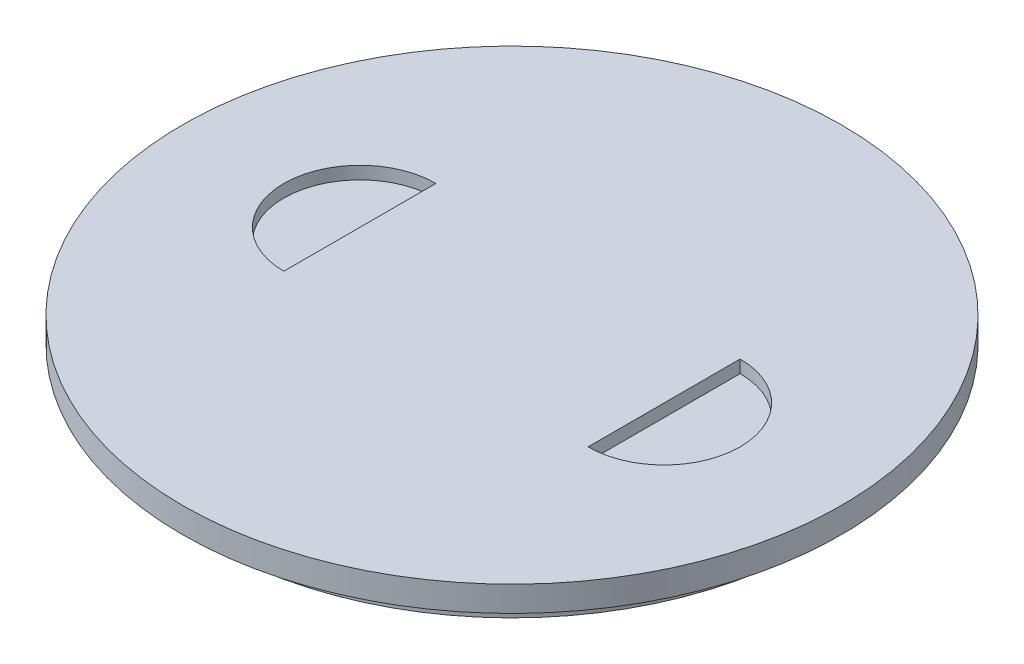
ISO-10303-21;
HEADER;
FILE_DESCRIPTION(('STEP AP214'),'2;1');
FILE_NAME('part.step','',(''),(''),'','','');
FILE_SCHEMA(('AUTOMOTIVE_DESIGN { 1 0 10303 214 1 1 1 1 }'));
ENDSEC;
DATA;
#1=APPLICATION_CONTEXT('core data for automotive mechanical design processes');
#2=APPLICATION_PROTOCOL_DEFINITION('international standard','automotive_design',2000,#1);
#3=PRODUCT_CONTEXT('',#1,'mechanical');
#4=PRODUCT('Part','Part','',(#3));
#5=PRODUCT_RELATED_PRODUCT_CATEGORY('part','',(#4));
#6=PRODUCT_DEFINITION_FORMATION('','',#4);
#7=PRODUCT_DEFINITION_CONTEXT('part definition',#1,'design');
#8=PRODUCT_DEFINITION('design','',#6,#7);
#9=PRODUCT_DEFINITION_SHAPE('','',#8);
#10=(LENGTH_UNIT() NAMED_UNIT(*) SI_UNIT(.MILLI.,.METRE.));
#11=(NAMED_UNIT(*) PLANE_ANGLE_UNIT() SI_UNIT($,.RADIAN.));
#12=(NAMED_UNIT(*) SI_UNIT($,.STERADIAN.) SOLID_ANGLE_UNIT());
#13=UNCERTAINTY_MEASURE_WITH_UNIT(LENGTH_MEASURE(1.E-05),#10,'distance_accuracy_value','');
#14=(GEOMETRIC_REPRESENTATION_CONTEXT(3) GLOBAL_UNCERTAINTY_ASSIGNED_CONTEXT((#13)) GLOBAL_UNIT_ASSIGNED_CONTEXT((#10,
#11,#12)) REPRESENTATION_CONTEXT('',''));
#15=CARTESIAN_POINT('',(0.,0.,0.));
#16=DIRECTION('',(0.,0.,1.));
#17=DIRECTION('',(1.,0.,0.));
#18=AXIS2_PLACEMENT_3D('',#15,#16,#17);
#19=CARTESIAN_POINT('',(0.,6.35,0.));
#20=DIRECTION('',(0.,-1.,0.));
#21=DIRECTION('',(0.,0.,-1.));
#22=AXIS2_PLACEMENT_3D('',#19,#20,#21);
#23=CYLINDRICAL_SURFACE('',#22,82.55);
#24=CARTESIAN_POINT('',(0.,6.35,0.));
#25=DIRECTION('',(0.,1.,0.));
#26=DIRECTION('',(0.,0.,1.));
#27=AXIS2_PLACEMENT_3D('',#24,#25,#26);
#28=CIRCLE('',#27,82.55);
#29=CARTESIAN_POINT('',(0.,6.35,82.55));
#30=VERTEX_POINT('',#29);
#31=EDGE_CURVE('E55',#30,#30,#28,.T.);
#32=ORIENTED_EDGE('',*,*,#31,.F.);
#33=EDGE_LOOP('',(#32));
#34=FACE_BOUND('',#33,.T.);
#35=CARTESIAN_POINT('',(0.,0.,0.));
#36=DIRECTION('',(0.,1.,0.));
#37=DIRECTION('',(0.,0.,1.));
#38=AXIS2_PLACEMENT_3D('',#35,#36,#37);
#39=CIRCLE('',#38,82.55);
#40=CARTESIAN_POINT('',(0.,0.,82.55));
#41=VERTEX_POINT('',#40);
#42=EDGE_CURVE('E143',#41,#41,#39,.T.);
#43=ORIENTED_EDGE('',*,*,#42,.T.);
#44=EDGE_LOOP('',(#43));
#45=FACE_BOUND('',#44,.T.);
#46=ADVANCED_FACE('F47',(#34,#45),#23,.T.);
#47=CARTESIAN_POINT('',(0.,6.35,0.));
#48=DIRECTION('',(0.,1.,0.));
#49=DIRECTION('',(0.,0.,1.));
#50=AXIS2_PLACEMENT_3D('',#47,#48,#49);
#51=PLANE('',#50);
#52=CARTESIAN_POINT('',(-38.1,6.35,0.));
#53=DIRECTION('',(0.,1.,0.));
#54=DIRECTION('',(0.,0.,1.));
#55=AXIS2_PLACEMENT_3D('',#52,#53,#54);
#56=CIRCLE('',#55,19.05);
#57=CARTESIAN_POINT('',(-38.1,6.35,-19.05));
#58=VERTEX_POINT('',#57);
#59=CARTESIAN_POINT('',(-38.1,6.35,19.05));
#60=VERTEX_POINT('',#59);
#61=EDGE_CURVE('E62',#58,#60,#56,.T.);
#62=ORIENTED_EDGE('',*,*,#61,.F.);
#63=DIRECTION('',(0.,0.,-1.));
#64=VECTOR('',#63,1.);
#65=CARTESIAN_POINT('',(-38.1,6.35,-19.05));
#66=LINE('',#65,#64);
#67=EDGE_CURVE('E102',#60,#58,#66,.T.);
#68=ORIENTED_EDGE('',*,*,#67,.F.);
#69=EDGE_LOOP('',(#62,#68));
#70=FACE_BOUND('',#69,.T.);
#71=CARTESIAN_POINT('',(38.1,6.35,0.));
#72=DIRECTION('',(0.,1.,0.));
#73=DIRECTION('',(0.,0.,-1.));
#74=AXIS2_PLACEMENT_3D('',#71,#72,#73);
#75=CIRCLE('',#74,19.05);
#76=CARTESIAN_POINT('',(38.1,6.35,19.05));
#77=VERTEX_POINT('',#76);
#78=CARTESIAN_POINT('',(38.1,6.35,-19.05));
#79=VERTEX_POINT('',#78);
#80=EDGE_CURVE('E70',#77,#79,#75,.T.);
#81=ORIENTED_EDGE('',*,*,#80,.F.);
#82=DIRECTION('',(0.,0.,1.));
#83=VECTOR('',#82,1.);
#84=CARTESIAN_POINT('',(38.1,6.35,-19.05));
#85=LINE('',#84,#83);
#86=EDGE_CURVE('E122',#79,#77,#85,.T.);
#87=ORIENTED_EDGE('',*,*,#86,.F.);
#88=EDGE_LOOP('',(#81,#87));
#89=FACE_BOUND('',#88,.T.);
#90=ORIENTED_EDGE('',*,*,#31,.T.);
#91=EDGE_LOOP('',(#90));
#92=FACE_BOUND('',#91,.T.);
#93=ADVANCED_FACE('F157',(#70,#89,#92),#51,.T.);
#94=CARTESIAN_POINT('',(0.,0.,0.));
#95=DIRECTION('',(0.,1.,0.));
#96=DIRECTION('',(0.,0.,1.));
#97=AXIS2_PLACEMENT_3D('',#94,#95,#96);
#98=PLANE('',#97);
#99=CARTESIAN_POINT('',(0.,0.,0.));
#100=DIRECTION('',(0.,1.,0.));
#101=DIRECTION('',(0.,0.,1.));
#102=AXIS2_PLACEMENT_3D('',#99,#100,#101);
#103=CIRCLE('',#102,74.93);
#104=CARTESIAN_POINT('',(0.,0.,74.93));
#105=VERTEX_POINT('',#104);
#106=EDGE_CURVE('E113',#105,#105,#103,.T.);
#107=ORIENTED_EDGE('',*,*,#106,.T.);
#108=EDGE_LOOP('',(#107));
#109=FACE_BOUND('',#108,.T.);
#110=ORIENTED_EDGE('',*,*,#42,.F.);
#111=EDGE_LOOP('',(#110));
#112=FACE_BOUND('',#111,.T.);
#113=ADVANCED_FACE('F154',(#109,#112),#98,.F.);
#114=CARTESIAN_POINT('',(0.,-6.35,0.));
#115=DIRECTION('',(0.,1.,0.));
#116=DIRECTION('',(0.,0.,1.));
#117=AXIS2_PLACEMENT_3D('',#114,#115,#116);
#118=CYLINDRICAL_SURFACE('',#117,69.85);
#119=CARTESIAN_POINT('',(0.,-6.35,0.));
#120=DIRECTION('',(0.,1.,0.));
#121=DIRECTION('',(0.,0.,1.));
#122=AXIS2_PLACEMENT_3D('',#119,#120,#121);
#123=CIRCLE('',#122,69.85);
#124=CARTESIAN_POINT('',(0.,-6.35,69.85));
#125=VERTEX_POINT('',#124);
#126=EDGE_CURVE('E135',#125,#125,#123,.T.);
#127=ORIENTED_EDGE('',*,*,#126,.F.);
#128=EDGE_LOOP('',(#127));
#129=FACE_BOUND('',#128,.T.);
#130=CARTESIAN_POINT('',(0.,0.,0.));
#131=DIRECTION('',(0.,1.,0.));
#132=DIRECTION('',(0.,0.,1.));
#133=AXIS2_PLACEMENT_3D('',#130,#131,#132);
#134=CIRCLE('',#133,69.85);
#135=CARTESIAN_POINT('',(0.,0.,69.85));
#136=VERTEX_POINT('',#135);
#137=EDGE_CURVE('E11',#136,#136,#134,.T.);
#138=ORIENTED_EDGE('',*,*,#137,.T.);
#139=EDGE_LOOP('',(#138));
#140=FACE_BOUND('',#139,.T.);
#141=ADVANCED_FACE('F156',(#129,#140),#118,.F.);
#142=CARTESIAN_POINT('',(0.,-6.35,0.));
#143=DIRECTION('',(0.,1.,0.));
#144=DIRECTION('',(0.,0.,1.));
#145=AXIS2_PLACEMENT_3D('',#142,#143,#144);
#146=CYLINDRICAL_SURFACE('',#145,74.93);
#147=CARTESIAN_POINT('',(0.,-6.35,0.));
#148=DIRECTION('',(0.,1.,0.));
#149=DIRECTION('',(0.,0.,1.));
#150=AXIS2_PLACEMENT_3D('',#147,#148,#149);
#151=CIRCLE('',#150,74.93);
#152=CARTESIAN_POINT('',(0.,-6.35,74.93));
#153=VERTEX_POINT('',#152);
#154=EDGE_CURVE('E139',#153,#153,#151,.T.);
#155=ORIENTED_EDGE('',*,*,#154,.T.);
#156=EDGE_LOOP('',(#155));
#157=FACE_BOUND('',#156,.T.);
#158=ORIENTED_EDGE('',*,*,#106,.F.);
#159=EDGE_LOOP('',(#158));
#160=FACE_BOUND('',#159,.T.);
#161=ADVANCED_FACE('F164',(#157,#160),#146,.T.);
#162=CARTESIAN_POINT('',(0.,-6.35,0.));
#163=DIRECTION('',(0.,1.,0.));
#164=DIRECTION('',(0.,0.,1.));
#165=AXIS2_PLACEMENT_3D('',#162,#163,#164);
#166=PLANE('',#165);
#167=ORIENTED_EDGE('',*,*,#126,.T.);
#168=EDGE_LOOP('',(#167));
#169=FACE_BOUND('',#168,.T.);
#170=ORIENTED_EDGE('',*,*,#154,.F.);
#171=EDGE_LOOP('',(#170));
#172=FACE_BOUND('',#171,.T.);
#173=ADVANCED_FACE('F172',(#169,#172),#166,.F.);
#174=ORIENTED_EDGE('',*,*,#137,.F.);
#175=EDGE_LOOP('',(#174));
#176=FACE_BOUND('',#175,.T.);
#177=ADVANCED_FACE('F159',(#176),#98,.F.);
#178=CARTESIAN_POINT('',(38.1,3.175,0.));
#179=DIRECTION('',(0.,1.,0.));
#180=DIRECTION('',(0.,0.,1.));
#181=AXIS2_PLACEMENT_3D('',#178,#179,#180);
#182=CYLINDRICAL_SURFACE('',#181,19.05);
#183=ORIENTED_EDGE('',*,*,#80,.T.);
#184=DIRECTION('',(0.,1.,0.));
#185=VECTOR('',#184,1.);
#186=CARTESIAN_POINT('',(38.1,3.175,-19.05));
#187=LINE('',#186,#185);
#188=CARTESIAN_POINT('',(38.1,3.175,-19.05));
#189=VERTEX_POINT('',#188);
#190=EDGE_CURVE('E115',#189,#79,#187,.T.);
#191=ORIENTED_EDGE('',*,*,#190,.F.);
#192=CARTESIAN_POINT('',(38.1,3.175,0.));
#193=DIRECTION('',(0.,1.,0.));
#194=DIRECTION('',(0.,0.,-1.));
#195=AXIS2_PLACEMENT_3D('',#192,#193,#194);
#196=CIRCLE('',#195,19.05);
#197=CARTESIAN_POINT('',(38.1,3.175,19.05));
#198=VERTEX_POINT('',#197);
#199=EDGE_CURVE('E126',#198,#189,#196,.T.);
#200=ORIENTED_EDGE('',*,*,#199,.F.);
#201=DIRECTION('',(0.,1.,0.));
#202=VECTOR('',#201,1.);
#203=CARTESIAN_POINT('',(38.1,3.175,19.05));
#204=LINE('',#203,#202);
#205=EDGE_CURVE('E119',#198,#77,#204,.T.);
#206=ORIENTED_EDGE('',*,*,#205,.T.);
#207=EDGE_LOOP('',(#183,#191,#200,#206));
#208=FACE_BOUND('',#207,.T.);
#209=ADVANCED_FACE('F171',(#208),#182,.F.);
#210=CARTESIAN_POINT('',(38.1,3.175,-19.05));
#211=DIRECTION('',(-1.,0.,0.));
#212=DIRECTION('',(0.,0.,1.));
#213=AXIS2_PLACEMENT_3D('',#210,#211,#212);
#214=PLANE('',#213);
#215=ORIENTED_EDGE('',*,*,#86,.T.);
#216=ORIENTED_EDGE('',*,*,#205,.F.);
#217=DIRECTION('',(0.,0.,1.));
#218=VECTOR('',#217,1.);
#219=CARTESIAN_POINT('',(38.1,3.175,-19.05));
#220=LINE('',#219,#218);
#221=EDGE_CURVE('E118',#189,#198,#220,.T.);
#222=ORIENTED_EDGE('',*,*,#221,.F.);
#223=ORIENTED_EDGE('',*,*,#190,.T.);
#224=EDGE_LOOP('',(#215,#216,#222,#223));
#225=FACE_BOUND('',#224,.T.);
#226=ADVANCED_FACE('F229',(#225),#214,.F.);
#227=CARTESIAN_POINT('',(38.1,3.175,0.));
#228=DIRECTION('',(0.,-1.,0.));
#229=DIRECTION('',(0.,0.,-1.));
#230=AXIS2_PLACEMENT_3D('',#227,#228,#229);
#231=PLANE('',#230);
#232=ORIENTED_EDGE('',*,*,#199,.T.);
#233=ORIENTED_EDGE('',*,*,#221,.T.);
#234=EDGE_LOOP('',(#232,#233));
#235=FACE_BOUND('',#234,.T.);
#236=ADVANCED_FACE('F238',(#235),#231,.F.);
#237=CARTESIAN_POINT('',(-38.1,3.175,0.));
#238=DIRECTION('',(0.,1.,0.));
#239=DIRECTION('',(0.,0.,1.));
#240=AXIS2_PLACEMENT_3D('',#237,#238,#239);
#241=CYLINDRICAL_SURFACE('',#240,19.05);
#242=ORIENTED_EDGE('',*,*,#61,.T.);
#243=DIRECTION('',(0.,1.,0.));
#244=VECTOR('',#243,1.);
#245=CARTESIAN_POINT('',(-38.1,3.175,19.05));
#246=LINE('',#245,#244);
#247=CARTESIAN_POINT('',(-38.1,3.175,19.05));
#248=VERTEX_POINT('',#247);
#249=EDGE_CURVE('E86',#248,#60,#246,.T.);
#250=ORIENTED_EDGE('',*,*,#249,.F.);
#251=CARTESIAN_POINT('',(-38.1,3.175,0.));
#252=DIRECTION('',(0.,1.,0.));
#253=DIRECTION('',(0.,0.,1.));
#254=AXIS2_PLACEMENT_3D('',#251,#252,#253);
#255=CIRCLE('',#254,19.05);
#256=CARTESIAN_POINT('',(-38.1,3.175,-19.05));
#257=VERTEX_POINT('',#256);
#258=EDGE_CURVE('E89',#257,#248,#255,.T.);
#259=ORIENTED_EDGE('',*,*,#258,.F.);
#260=DIRECTION('',(0.,1.,0.));
#261=VECTOR('',#260,1.);
#262=CARTESIAN_POINT('',(-38.1,3.175,-19.05));
#263=LINE('',#262,#261);
#264=EDGE_CURVE('E96',#257,#58,#263,.T.);
#265=ORIENTED_EDGE('',*,*,#264,.T.);
#266=EDGE_LOOP('',(#242,#250,#259,#265));
#267=FACE_BOUND('',#266,.T.);
#268=ADVANCED_FACE('F88',(#267),#241,.F.);
#269=CARTESIAN_POINT('',(-38.1,3.175,-19.05));
#270=DIRECTION('',(1.,0.,0.));
#271=DIRECTION('',(0.,0.,-1.));
#272=AXIS2_PLACEMENT_3D('',#269,#270,#271);
#273=PLANE('',#272);
#274=ORIENTED_EDGE('',*,*,#67,.T.);
#275=ORIENTED_EDGE('',*,*,#264,.F.);
#276=DIRECTION('',(0.,0.,-1.));
#277=VECTOR('',#276,1.);
#278=CARTESIAN_POINT('',(-38.1,3.175,-19.05));
#279=LINE('',#278,#277);
#280=EDGE_CURVE('E97',#248,#257,#279,.T.);
#281=ORIENTED_EDGE('',*,*,#280,.F.);
#282=ORIENTED_EDGE('',*,*,#249,.T.);
#283=EDGE_LOOP('',(#274,#275,#281,#282));
#284=FACE_BOUND('',#283,.T.);
#285=ADVANCED_FACE('F104',(#284),#273,.F.);
#286=CARTESIAN_POINT('',(-38.1,3.175,0.));
#287=DIRECTION('',(0.,1.,0.));
#288=DIRECTION('',(0.,0.,1.));
#289=AXIS2_PLACEMENT_3D('',#286,#287,#288);
#290=PLANE('',#289);
#291=ORIENTED_EDGE('',*,*,#258,.T.);
#292=ORIENTED_EDGE('',*,*,#280,.T.);
#293=EDGE_LOOP('',(#291,#292));
#294=FACE_BOUND('',#293,.T.);
#295=ADVANCED_FACE('F100',(#294),#290,.T.);
#296=CLOSED_SHELL('',(#46,#93,#113,#141,#161,#173,#177,#209,#226,#236,#268,#285,#295));
#297=MANIFOLD_SOLID_BREP('B2',#296);
#298=ADVANCED_BREP_SHAPE_REPRESENTATION('',(#18,#297),#14);
#299=SHAPE_DEFINITION_REPRESENTATION(#9,#298);
ENDSEC;
END-ISO-10303-21;
